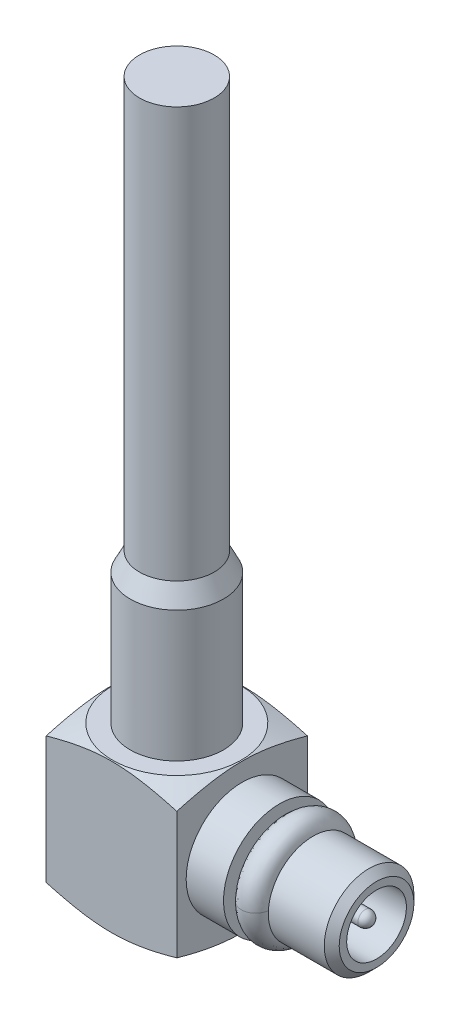
ISO-10303-21;
HEADER;
FILE_DESCRIPTION(('STEP AP214'),'2;1');
FILE_NAME('part.step','',(''),(''),'','','');
FILE_SCHEMA(('AUTOMOTIVE_DESIGN { 1 0 10303 214 1 1 1 1 }'));
ENDSEC;
DATA;
#1=APPLICATION_CONTEXT('core data for automotive mechanical design processes');
#2=APPLICATION_PROTOCOL_DEFINITION('international standard','automotive_design',2000,#1);
#3=PRODUCT_CONTEXT('',#1,'mechanical');
#4=PRODUCT('Part','Part','',(#3));
#5=PRODUCT_RELATED_PRODUCT_CATEGORY('part','',(#4));
#6=PRODUCT_DEFINITION_FORMATION('','',#4);
#7=PRODUCT_DEFINITION_CONTEXT('part definition',#1,'design');
#8=PRODUCT_DEFINITION('design','',#6,#7);
#9=PRODUCT_DEFINITION_SHAPE('','',#8);
#10=(LENGTH_UNIT() NAMED_UNIT(*) SI_UNIT(.MILLI.,.METRE.));
#11=(NAMED_UNIT(*) PLANE_ANGLE_UNIT() SI_UNIT($,.RADIAN.));
#12=(NAMED_UNIT(*) SI_UNIT($,.STERADIAN.) SOLID_ANGLE_UNIT());
#13=UNCERTAINTY_MEASURE_WITH_UNIT(LENGTH_MEASURE(1.E-05),#10,'distance_accuracy_value','');
#14=(GEOMETRIC_REPRESENTATION_CONTEXT(3) GLOBAL_UNCERTAINTY_ASSIGNED_CONTEXT((#13)) GLOBAL_UNIT_ASSIGNED_CONTEXT((#10,
#11,#12)) REPRESENTATION_CONTEXT('',''));
#15=CARTESIAN_POINT('',(0.,0.,0.));
#16=DIRECTION('',(0.,0.,1.));
#17=DIRECTION('',(1.,0.,0.));
#18=AXIS2_PLACEMENT_3D('',#15,#16,#17);
#19=CARTESIAN_POINT('',(5.05,2.,0.));
#20=DIRECTION('',(0.,0.,1.));
#21=DIRECTION('',(-1.,0.,0.));
#22=AXIS2_PLACEMENT_3D('',#19,#20,#21);
#23=SPHERICAL_SURFACE('',#22,0.2);
#24=CARTESIAN_POINT('',(5.05,2.,0.));
#25=DIRECTION('',(-1.,0.,0.));
#26=DIRECTION('',(0.,0.,1.));
#27=AXIS2_PLACEMENT_3D('',#24,#25,#26);
#28=CIRCLE('',#27,0.2);
#29=CARTESIAN_POINT('',(5.05,1.99999999993847,-0.2));
#30=VERTEX_POINT('',#29);
#31=CARTESIAN_POINT('',(5.05,1.99999999999102,0.2));
#32=VERTEX_POINT('',#31);
#33=EDGE_CURVE('E272',#30,#32,#28,.F.);
#34=ORIENTED_EDGE('',*,*,#33,.T.);
#35=CARTESIAN_POINT('',(5.05,2.,0.));
#36=DIRECTION('',(-1.,0.,0.));
#37=DIRECTION('',(0.,0.,1.));
#38=AXIS2_PLACEMENT_3D('',#35,#36,#37);
#39=CIRCLE('',#38,0.2);
#40=EDGE_CURVE('E167',#32,#30,#39,.F.);
#41=ORIENTED_EDGE('',*,*,#40,.T.);
#42=EDGE_LOOP('',(#34,#41));
#43=FACE_BOUND('',#42,.T.);
#44=ADVANCED_FACE('F35',(#43),#23,.T.);
#45=CARTESIAN_POINT('',(5.05,2.,0.));
#46=DIRECTION('',(-1.,0.,0.));
#47=DIRECTION('',(0.,-1.,0.));
#48=AXIS2_PLACEMENT_3D('',#45,#46,#47);
#49=CYLINDRICAL_SURFACE('',#48,0.2);
#50=CARTESIAN_POINT('',(3.85,2.,0.));
#51=DIRECTION('',(-1.,0.,0.));
#52=DIRECTION('',(0.,-1.,0.));
#53=AXIS2_PLACEMENT_3D('',#50,#51,#52);
#54=CIRCLE('',#53,0.2);
#55=CARTESIAN_POINT('',(3.85,1.8,0.));
#56=VERTEX_POINT('',#55);
#57=EDGE_CURVE('E39',#56,#56,#54,.T.);
#58=ORIENTED_EDGE('',*,*,#57,.F.);
#59=EDGE_LOOP('',(#58));
#60=FACE_BOUND('',#59,.T.);
#61=ORIENTED_EDGE('',*,*,#33,.F.);
#62=ORIENTED_EDGE('',*,*,#40,.F.);
#63=EDGE_LOOP('',(#61,#62));
#64=FACE_BOUND('',#63,.T.);
#65=ADVANCED_FACE('F173',(#60,#64),#49,.T.);
#66=CARTESIAN_POINT('',(3.85,1.1904,0.8096));
#67=DIRECTION('',(1.,0.,0.));
#68=DIRECTION('',(0.,0.,-1.));
#69=AXIS2_PLACEMENT_3D('',#66,#67,#68);
#70=PLANE('',#69);
#71=ORIENTED_EDGE('',*,*,#57,.T.);
#72=EDGE_LOOP('',(#71));
#73=FACE_BOUND('',#72,.T.);
#74=CARTESIAN_POINT('',(3.85,2.,0.));
#75=DIRECTION('',(1.,0.,0.));
#76=DIRECTION('',(0.,1.,0.));
#77=AXIS2_PLACEMENT_3D('',#74,#75,#76);
#78=CIRCLE('',#77,0.8);
#79=CARTESIAN_POINT('',(3.85,2.8,0.));
#80=VERTEX_POINT('',#79);
#81=EDGE_CURVE('E279',#80,#80,#78,.F.);
#82=ORIENTED_EDGE('',*,*,#81,.F.);
#83=EDGE_LOOP('',(#82));
#84=FACE_BOUND('',#83,.T.);
#85=ADVANCED_FACE('F176',(#73,#84),#70,.T.);
#86=CARTESIAN_POINT('',(3.85,2.,0.));
#87=DIRECTION('',(1.,0.,0.));
#88=DIRECTION('',(0.,1.,0.));
#89=AXIS2_PLACEMENT_3D('',#86,#87,#88);
#90=CYLINDRICAL_SURFACE('',#89,0.8);
#91=CARTESIAN_POINT('',(5.35,2.,0.));
#92=DIRECTION('',(1.,0.,0.));
#93=DIRECTION('',(0.,1.,0.));
#94=AXIS2_PLACEMENT_3D('',#91,#92,#93);
#95=CIRCLE('',#94,0.8);
#96=CARTESIAN_POINT('',(5.35,2.8,0.));
#97=VERTEX_POINT('',#96);
#98=EDGE_CURVE('E513',#97,#97,#95,.F.);
#99=ORIENTED_EDGE('',*,*,#98,.F.);
#100=EDGE_LOOP('',(#99));
#101=FACE_BOUND('',#100,.T.);
#102=ORIENTED_EDGE('',*,*,#81,.T.);
#103=EDGE_LOOP('',(#102));
#104=FACE_BOUND('',#103,.T.);
#105=ADVANCED_FACE('F179',(#101,#104),#90,.F.);
#106=CARTESIAN_POINT('',(5.35,0.988,1.012));
#107=DIRECTION('',(1.,0.,0.));
#108=DIRECTION('',(0.,0.,-1.));
#109=AXIS2_PLACEMENT_3D('',#106,#107,#108);
#110=PLANE('',#109);
#111=ORIENTED_EDGE('',*,*,#98,.T.);
#112=EDGE_LOOP('',(#111));
#113=FACE_BOUND('',#112,.T.);
#114=CARTESIAN_POINT('',(5.34999999999997,2.,0.));
#115=DIRECTION('',(-1.,0.,0.));
#116=DIRECTION('',(0.,0.,1.));
#117=AXIS2_PLACEMENT_3D('',#114,#115,#116);
#118=CIRCLE('',#117,1.00000000000003);
#119=CARTESIAN_POINT('',(5.34999999999997,2.,1.00000000000003));
#120=VERTEX_POINT('',#119);
#121=EDGE_CURVE('E164',#120,#120,#118,.F.);
#122=ORIENTED_EDGE('',*,*,#121,.T.);
#123=EDGE_LOOP('',(#122));
#124=FACE_BOUND('',#123,.T.);
#125=ADVANCED_FACE('F181',(#113,#124),#110,.T.);
#126=CARTESIAN_POINT('',(5.35,2.,0.));
#127=DIRECTION('',(-1.,0.,0.));
#128=DIRECTION('',(0.,0.,1.));
#129=AXIS2_PLACEMENT_3D('',#126,#127,#128);
#130=CONICAL_SURFACE('',#129,1.,0.785398163397447);
#131=ORIENTED_EDGE('',*,*,#121,.F.);
#132=EDGE_LOOP('',(#131));
#133=FACE_BOUND('',#132,.T.);
#134=CARTESIAN_POINT('',(5.15,2.,0.));
#135=DIRECTION('',(-1.,0.,0.));
#136=DIRECTION('',(0.,0.,1.));
#137=AXIS2_PLACEMENT_3D('',#134,#135,#136);
#138=CIRCLE('',#137,1.2);
#139=CARTESIAN_POINT('',(5.15,2.,1.2));
#140=VERTEX_POINT('',#139);
#141=EDGE_CURVE('E160',#140,#140,#138,.F.);
#142=ORIENTED_EDGE('',*,*,#141,.T.);
#143=EDGE_LOOP('',(#142));
#144=FACE_BOUND('',#143,.T.);
#145=ADVANCED_FACE('F184',(#133,#144),#130,.T.);
#146=CARTESIAN_POINT('',(5.15,2.,0.));
#147=DIRECTION('',(-1.,0.,0.));
#148=DIRECTION('',(0.,-1.,0.));
#149=AXIS2_PLACEMENT_3D('',#146,#147,#148);
#150=CYLINDRICAL_SURFACE('',#149,1.2);
#151=ORIENTED_EDGE('',*,*,#141,.F.);
#152=EDGE_LOOP('',(#151));
#153=FACE_BOUND('',#152,.T.);
#154=CARTESIAN_POINT('',(3.65,2.,0.));
#155=DIRECTION('',(-1.,0.,0.));
#156=DIRECTION('',(0.,-1.,0.));
#157=AXIS2_PLACEMENT_3D('',#154,#155,#156);
#158=CIRCLE('',#157,1.2);
#159=CARTESIAN_POINT('',(3.65,0.8,0.));
#160=VERTEX_POINT('',#159);
#161=EDGE_CURVE('E163',#160,#160,#158,.F.);
#162=ORIENTED_EDGE('',*,*,#161,.T.);
#163=EDGE_LOOP('',(#162));
#164=FACE_BOUND('',#163,.T.);
#165=ADVANCED_FACE('F190',(#153,#164),#150,.T.);
#166=CARTESIAN_POINT('',(3.65,0.7856,1.2144));
#167=DIRECTION('',(1.,0.,0.));
#168=DIRECTION('',(0.,0.,-1.));
#169=AXIS2_PLACEMENT_3D('',#166,#167,#168);
#170=PLANE('',#169);
#171=CARTESIAN_POINT('',(3.65,2.,0.));
#172=DIRECTION('',(-1.,0.,0.));
#173=DIRECTION('',(0.,0.,1.));
#174=AXIS2_PLACEMENT_3D('',#171,#172,#173);
#175=CIRCLE('',#174,1.);
#176=CARTESIAN_POINT('',(3.65,2.,1.));
#177=VERTEX_POINT('',#176);
#178=EDGE_CURVE('E153',#177,#177,#175,.F.);
#179=ORIENTED_EDGE('',*,*,#178,.T.);
#180=EDGE_LOOP('',(#179));
#181=FACE_BOUND('',#180,.T.);
#182=ORIENTED_EDGE('',*,*,#161,.F.);
#183=EDGE_LOOP('',(#182));
#184=FACE_BOUND('',#183,.T.);
#185=ADVANCED_FACE('F186',(#181,#184),#170,.F.);
#186=CARTESIAN_POINT('',(3.65,2.,0.));
#187=DIRECTION('',(-1.,0.,0.));
#188=DIRECTION('',(0.,0.,1.));
#189=AXIS2_PLACEMENT_3D('',#186,#187,#188);
#190=CYLINDRICAL_SURFACE('',#189,1.);
#191=CARTESIAN_POINT('',(3.56918829912818,2.,0.));
#192=DIRECTION('',(-1.,0.,0.));
#193=DIRECTION('',(0.,-1.,0.));
#194=AXIS2_PLACEMENT_3D('',#191,#192,#193);
#195=CIRCLE('',#194,1.00000000011661);
#196=CARTESIAN_POINT('',(3.56918829909613,2.,1.00000000008745));
#197=VERTEX_POINT('',#196);
#198=CARTESIAN_POINT('',(3.56918829909613,1.99999999989745,-1.00000000008745));
#199=VERTEX_POINT('',#198);
#200=EDGE_CURVE('E128',#197,#199,#195,.T.);
#201=ORIENTED_EDGE('',*,*,#200,.F.);
#202=CARTESIAN_POINT('',(3.56918829912818,2.,0.));
#203=DIRECTION('',(-1.,0.,0.));
#204=DIRECTION('',(0.,-1.,0.));
#205=AXIS2_PLACEMENT_3D('',#202,#203,#204);
#206=CIRCLE('',#205,1.00000000011661);
#207=EDGE_CURVE('E147',#199,#197,#206,.T.);
#208=ORIENTED_EDGE('',*,*,#207,.F.);
#209=EDGE_LOOP('',(#201,#208));
#210=FACE_BOUND('',#209,.T.);
#211=ORIENTED_EDGE('',*,*,#178,.F.);
#212=EDGE_LOOP('',(#211));
#213=FACE_BOUND('',#212,.T.);
#214=ADVANCED_FACE('F189',(#210,#213),#190,.T.);
#215=CARTESIAN_POINT('',(2.841641112,2.,-0.963592296));
#216=CARTESIAN_POINT('',(2.841641112,0.072815408,-0.963592296));
#217=CARTESIAN_POINT('',(2.841641112,0.072815408,0.963592296));
#218=CARTESIAN_POINT('',(2.841641112,2.,0.963592296));
#219=CARTESIAN_POINT('',(2.745890609,2.,-1.235039707));
#220=CARTESIAN_POINT('',(2.745890609,-0.470079413,-1.235039707));
#221=CARTESIAN_POINT('',(2.745890609,-0.470079413,1.235039707));
#222=CARTESIAN_POINT('',(2.745890609,2.,1.235039707));
#223=CARTESIAN_POINT('',(2.912160017,2.,-1.47));
#224=CARTESIAN_POINT('',(2.912160017,-0.94,-1.47));
#225=CARTESIAN_POINT('',(2.912160017,-0.94,1.47));
#226=CARTESIAN_POINT('',(2.912160017,2.,1.47));
#227=CARTESIAN_POINT('',(3.2,2.,-1.47));
#228=CARTESIAN_POINT('',(3.2,-0.94,-1.47));
#229=CARTESIAN_POINT('',(3.2,-0.94,1.47));
#230=CARTESIAN_POINT('',(3.2,2.,1.47));
#231=CARTESIAN_POINT('',(3.487839983,2.,-1.47));
#232=CARTESIAN_POINT('',(3.487839983,-0.94,-1.47));
#233=CARTESIAN_POINT('',(3.487839983,-0.94,1.47));
#234=CARTESIAN_POINT('',(3.487839983,2.,1.47));
#235=CARTESIAN_POINT('',(3.654109391,2.,-1.235039707));
#236=CARTESIAN_POINT('',(3.654109391,-0.470079413,-1.235039707));
#237=CARTESIAN_POINT('',(3.654109391,-0.470079413,1.235039707));
#238=CARTESIAN_POINT('',(3.654109391,2.,1.235039707));
#239=CARTESIAN_POINT('',(3.558358888,2.,-0.963592296));
#240=CARTESIAN_POINT('',(3.558358888,0.072815408,-0.963592296));
#241=CARTESIAN_POINT('',(3.558358888,0.072815408,0.963592296));
#242=CARTESIAN_POINT('',(3.558358888,2.,0.963592296));
#243=(BOUNDED_SURFACE() B_SPLINE_SURFACE(3,3,((#215,#216,#217,#218),(#219,#220,#221,#222),(#223,
#224,#225,#226),(#227,#228,#229,#230),(#231,#232,#233,#234),(#235,#236,#237,#238),(#239,#240,
#241,#242)),.UNSPECIFIED.,.F.,.F.,.F.) B_SPLINE_SURFACE_WITH_KNOTS((4,3,4),(4,4),(0.,0.5,1.),
(0.,1.),.UNSPECIFIED.) GEOMETRIC_REPRESENTATION_ITEM() RATIONAL_B_SPLINE_SURFACE(((1.,
0.333333333333333,0.333333333333333,1.),(0.71843018897567,0.239476729658557,0.239476729658557,
0.71843018897567),(0.71843018897567,0.239476729658557,0.239476729658557,0.71843018897567),(1.,
0.333333333333333,0.333333333333333,1.),(0.71843018897567,0.239476729658557,0.239476729658557,
0.71843018897567),(0.71843018897567,0.239476729658557,0.239476729658557,0.71843018897567),(1.,
0.333333333333333,0.333333333333333,1.))) REPRESENTATION_ITEM('') SURFACE());
#244=CARTESIAN_POINT('',(2.841641112,2.,0.963592296));
#245=CARTESIAN_POINT('',(2.745890609,2.,1.235039707));
#246=CARTESIAN_POINT('',(2.912160017,2.,1.47));
#247=CARTESIAN_POINT('',(3.2,2.,1.47));
#248=CARTESIAN_POINT('',(3.487839983,2.,1.47));
#249=CARTESIAN_POINT('',(3.654109391,2.,1.235039707));
#250=CARTESIAN_POINT('',(3.558358888,2.,0.963592296));
#251=(BOUNDED_CURVE() B_SPLINE_CURVE(3,(#244,#245,#246,#247,#248,#249,#250),.UNSPECIFIED.,.F.,
.F.) B_SPLINE_CURVE_WITH_KNOTS((4,3,4),(0.,0.5,1.),
.UNSPECIFIED.) CURVE() GEOMETRIC_REPRESENTATION_ITEM() RATIONAL_B_SPLINE_CURVE((1.,
0.71843018897567,0.71843018897567,1.,0.71843018897567,0.71843018897567,1.)) REPRESENTATION_ITEM(''));
#252=CARTESIAN_POINT('',(2.83081170097646,1.9999999999551,0.999999999994262));
#253=VERTEX_POINT('',#252);
#254=EDGE_CURVE('E122',#253,#197,#251,.T.);
#255=CARTESIAN_POINT('',(2.830811701,2.,0.));
#256=DIRECTION('',(-1.,0.,0.));
#257=DIRECTION('',(0.,0.,1.));
#258=AXIS2_PLACEMENT_3D('',#255,#256,#257);
#259=CIRCLE('',#258,1.);
#260=CARTESIAN_POINT('',(2.83081170097646,1.99999999969234,-0.999999999994262));
#261=VERTEX_POINT('',#260);
#262=EDGE_CURVE('E118',#253,#261,#259,.F.);
#263=CARTESIAN_POINT('',(2.841641112,2.,-0.963592296));
#264=CARTESIAN_POINT('',(2.745890609,2.,-1.235039707));
#265=CARTESIAN_POINT('',(2.912160017,2.,-1.47));
#266=CARTESIAN_POINT('',(3.2,2.,-1.47));
#267=CARTESIAN_POINT('',(3.487839983,2.,-1.47));
#268=CARTESIAN_POINT('',(3.654109391,2.,-1.235039707));
#269=CARTESIAN_POINT('',(3.558358888,2.,-0.963592296));
#270=(BOUNDED_CURVE() B_SPLINE_CURVE(3,(#263,#264,#265,#266,#267,#268,#269),.UNSPECIFIED.,.F.,
.F.) B_SPLINE_CURVE_WITH_KNOTS((4,3,4),(0.,0.5,1.),
.UNSPECIFIED.) CURVE() GEOMETRIC_REPRESENTATION_ITEM() RATIONAL_B_SPLINE_CURVE((1.,
0.71843018897567,0.71843018897567,1.,0.71843018897567,0.71843018897567,1.)) REPRESENTATION_ITEM(''));
#271=EDGE_CURVE('E125',#199,#261,#270,.F.);
#272=ORIENTED_EDGE('',*,*,#254,.F.);
#273=ORIENTED_EDGE('',*,*,#262,.T.);
#274=ORIENTED_EDGE('',*,*,#271,.F.);
#275=ORIENTED_EDGE('',*,*,#207,.T.);
#276=EDGE_LOOP('',(#272,#273,#274,#275));
#277=FACE_BOUND('',#276,.T.);
#278=ADVANCED_FACE('F381',(#277),#243,.T.);
#279=CARTESIAN_POINT('',(2.841641112,2.,0.963592296));
#280=CARTESIAN_POINT('',(2.841641112,3.927184592,0.963592296));
#281=CARTESIAN_POINT('',(2.841641112,3.927184592,-0.963592296));
#282=CARTESIAN_POINT('',(2.841641112,2.,-0.963592296));
#283=CARTESIAN_POINT('',(2.745890609,2.,1.235039707));
#284=CARTESIAN_POINT('',(2.745890609,4.470079413,1.235039707));
#285=CARTESIAN_POINT('',(2.745890609,4.470079413,-1.235039707));
#286=CARTESIAN_POINT('',(2.745890609,2.,-1.235039707));
#287=CARTESIAN_POINT('',(2.912160017,2.,1.47));
#288=CARTESIAN_POINT('',(2.912160017,4.94,1.47));
#289=CARTESIAN_POINT('',(2.912160017,4.94,-1.47));
#290=CARTESIAN_POINT('',(2.912160017,2.,-1.47));
#291=CARTESIAN_POINT('',(3.2,2.,1.47));
#292=CARTESIAN_POINT('',(3.2,4.94,1.47));
#293=CARTESIAN_POINT('',(3.2,4.94,-1.47));
#294=CARTESIAN_POINT('',(3.2,2.,-1.47));
#295=CARTESIAN_POINT('',(3.487839983,2.,1.47));
#296=CARTESIAN_POINT('',(3.487839983,4.94,1.47));
#297=CARTESIAN_POINT('',(3.487839983,4.94,-1.47));
#298=CARTESIAN_POINT('',(3.487839983,2.,-1.47));
#299=CARTESIAN_POINT('',(3.654109391,2.,1.235039707));
#300=CARTESIAN_POINT('',(3.654109391,4.470079413,1.235039707));
#301=CARTESIAN_POINT('',(3.654109391,4.470079413,-1.235039707));
#302=CARTESIAN_POINT('',(3.654109391,2.,-1.235039707));
#303=CARTESIAN_POINT('',(3.558358888,2.,0.963592296));
#304=CARTESIAN_POINT('',(3.558358888,3.927184592,0.963592296));
#305=CARTESIAN_POINT('',(3.558358888,3.927184592,-0.963592296));
#306=CARTESIAN_POINT('',(3.558358888,2.,-0.963592296));
#307=(BOUNDED_SURFACE() B_SPLINE_SURFACE(3,3,((#279,#280,#281,#282),(#283,#284,#285,#286),(#287,
#288,#289,#290),(#291,#292,#293,#294),(#295,#296,#297,#298),(#299,#300,#301,#302),(#303,#304,
#305,#306)),.UNSPECIFIED.,.F.,.F.,.F.) B_SPLINE_SURFACE_WITH_KNOTS((4,3,4),(4,4),(0.,0.5,1.),
(0.,1.),.UNSPECIFIED.) GEOMETRIC_REPRESENTATION_ITEM() RATIONAL_B_SPLINE_SURFACE(((1.,
0.333333333333333,0.333333333333333,1.),(0.71843018897567,0.239476729658557,0.239476729658557,
0.71843018897567),(0.71843018897567,0.239476729658557,0.239476729658557,0.71843018897567),(1.,
0.333333333333333,0.333333333333333,1.),(0.71843018897567,0.239476729658557,0.239476729658557,
0.71843018897567),(0.71843018897567,0.239476729658557,0.239476729658557,0.71843018897567),(1.,
0.333333333333333,0.333333333333333,1.))) REPRESENTATION_ITEM('') SURFACE());
#308=CARTESIAN_POINT('',(2.830811701,2.,0.));
#309=DIRECTION('',(-1.,0.,0.));
#310=DIRECTION('',(0.,0.,1.));
#311=AXIS2_PLACEMENT_3D('',#308,#309,#310);
#312=CIRCLE('',#311,1.);
#313=EDGE_CURVE('E121',#261,#253,#312,.F.);
#314=ORIENTED_EDGE('',*,*,#313,.T.);
#315=ORIENTED_EDGE('',*,*,#254,.T.);
#316=ORIENTED_EDGE('',*,*,#200,.T.);
#317=ORIENTED_EDGE('',*,*,#271,.T.);
#318=EDGE_LOOP('',(#314,#315,#316,#317));
#319=FACE_BOUND('',#318,.T.);
#320=ADVANCED_FACE('F373',(#319),#307,.T.);
#321=CARTESIAN_POINT('',(2.830811701,2.,0.));
#322=DIRECTION('',(-1.,0.,0.));
#323=DIRECTION('',(0.,0.,1.));
#324=AXIS2_PLACEMENT_3D('',#321,#322,#323);
#325=CYLINDRICAL_SURFACE('',#324,1.);
#326=CARTESIAN_POINT('',(2.75,2.,0.));
#327=DIRECTION('',(-1.,0.,0.));
#328=DIRECTION('',(0.,0.,1.));
#329=AXIS2_PLACEMENT_3D('',#326,#327,#328);
#330=CIRCLE('',#329,1.);
#331=CARTESIAN_POINT('',(2.75,2.,1.));
#332=VERTEX_POINT('',#331);
#333=EDGE_CURVE('E138',#332,#332,#330,.T.);
#334=ORIENTED_EDGE('',*,*,#333,.F.);
#335=EDGE_LOOP('',(#334));
#336=FACE_BOUND('',#335,.T.);
#337=ORIENTED_EDGE('',*,*,#313,.F.);
#338=ORIENTED_EDGE('',*,*,#262,.F.);
#339=EDGE_LOOP('',(#337,#338));
#340=FACE_BOUND('',#339,.T.);
#341=ADVANCED_FACE('F196',(#336,#340),#325,.T.);
#342=CARTESIAN_POINT('',(2.75,0.482,1.518));
#343=DIRECTION('',(1.,0.,0.));
#344=DIRECTION('',(0.,0.,-1.));
#345=AXIS2_PLACEMENT_3D('',#342,#343,#344);
#346=PLANE('',#345);
#347=ORIENTED_EDGE('',*,*,#333,.T.);
#348=EDGE_LOOP('',(#347));
#349=FACE_BOUND('',#348,.T.);
#350=CARTESIAN_POINT('',(2.75,2.,0.));
#351=DIRECTION('',(-1.,0.,0.));
#352=DIRECTION('',(0.,0.,1.));
#353=AXIS2_PLACEMENT_3D('',#350,#351,#352);
#354=CIRCLE('',#353,1.5);
#355=CARTESIAN_POINT('',(2.75,2.,1.5));
#356=VERTEX_POINT('',#355);
#357=EDGE_CURVE('E526',#356,#356,#354,.F.);
#358=ORIENTED_EDGE('',*,*,#357,.T.);
#359=EDGE_LOOP('',(#358));
#360=FACE_BOUND('',#359,.T.);
#361=ADVANCED_FACE('F192',(#349,#360),#346,.T.);
#362=CARTESIAN_POINT('',(-1.745572219,0.,-1.745572219));
#363=DIRECTION('',(0.,1.,0.));
#364=DIRECTION('',(0.,0.,1.));
#365=AXIS2_PLACEMENT_3D('',#362,#363,#364);
#366=PLANE('',#365);
#367=CARTESIAN_POINT('',(0.,-4.18998275203259E-10,0.));
#368=DIRECTION('',(0.,1.,0.));
#369=DIRECTION('',(0.,0.,1.));
#370=AXIS2_PLACEMENT_3D('',#367,#368,#369);
#371=CIRCLE('',#370,1.72487373429371);
#372=CARTESIAN_POINT('',(0.,-4.18998275203259E-10,1.72487373429371));
#373=VERTEX_POINT('',#372);
#374=EDGE_CURVE('E98',#373,#373,#371,.F.);
#375=ORIENTED_EDGE('',*,*,#374,.T.);
#376=EDGE_LOOP('',(#375));
#377=FACE_BOUND('',#376,.T.);
#378=ADVANCED_FACE('F195',(#377),#366,.F.);
#379=CARTESIAN_POINT('',(2.75,2.,0.));
#380=DIRECTION('',(-1.,0.,0.));
#381=DIRECTION('',(0.,0.,1.));
#382=AXIS2_PLACEMENT_3D('',#379,#380,#381);
#383=CYLINDRICAL_SURFACE('',#382,1.5);
#384=ORIENTED_EDGE('',*,*,#357,.F.);
#385=EDGE_LOOP('',(#384));
#386=FACE_BOUND('',#385,.T.);
#387=CARTESIAN_POINT('',(1.75,2.,0.));
#388=DIRECTION('',(-1.,0.,0.));
#389=DIRECTION('',(0.,0.,1.));
#390=AXIS2_PLACEMENT_3D('',#387,#388,#389);
#391=CIRCLE('',#390,1.5);
#392=CARTESIAN_POINT('',(1.75,2.,1.5));
#393=VERTEX_POINT('',#392);
#394=EDGE_CURVE('E112',#393,#393,#391,.F.);
#395=ORIENTED_EDGE('',*,*,#394,.T.);
#396=EDGE_LOOP('',(#395));
#397=FACE_BOUND('',#396,.T.);
#398=ADVANCED_FACE('F200',(#386,#397),#383,.T.);
#399=CARTESIAN_POINT('',(0.,-4.18991162836994E-10,0.));
#400=DIRECTION('',(0.,1.,0.));
#401=DIRECTION('',(0.,0.,1.));
#402=AXIS2_PLACEMENT_3D('',#399,#400,#401);
#403=CONICAL_SURFACE('',#402,1.72487373429373,1.19028994906997);
#404=CARTESIAN_POINT('',(-1.75000000005264,0.300000000001926,1.74999999995095));
#405=CARTESIAN_POINT('',(-1.75000000001891,0.277343892377994,1.66984025484135));
#406=CARTESIAN_POINT('',(-1.75000000000507,0.255376495742548,1.58947507055314));
#407=CARTESIAN_POINT('',(-1.74999999999493,0.213250057796904,1.42822964975774));
#408=CARTESIAN_POINT('',(-1.74999999999864,0.193091953293528,1.34734916938965));
#409=CARTESIAN_POINT('',(-1.75000000000137,0.154929292887335,1.18458232255644));
#410=CARTESIAN_POINT('',(-1.75000000000037,0.136937858724414,1.10269284413399));
#411=CARTESIAN_POINT('',(-1.74999999999963,0.103820651591177,0.938340482380735));
#412=CARTESIAN_POINT('',(-1.7499999999999,0.0886945065931123,0.855877674934067));
#413=CARTESIAN_POINT('',(-1.75000000000009,0.0623358238787216,0.692802059846125));
#414=CARTESIAN_POINT('',(-1.75000000000003,0.0510021973246043,0.612205832563477));
#415=CARTESIAN_POINT('',(-1.74999999999998,0.0322176998984324,0.450564347562989));
#416=CARTESIAN_POINT('',(-1.74999999999999,0.0247663273961863,0.36951914922551));
#417=CARTESIAN_POINT('',(-1.75000000000001,0.0142241930304569,0.207366130271185));
#418=CARTESIAN_POINT('',(-1.75,0.0111213074862501,0.126259117092636));
#419=CARTESIAN_POINT('',(-1.75,0.00944519765535009,-0.0359956845704734));
#420=CARTESIAN_POINT('',(-1.75,0.010871770195776,-0.117143471062859));
#421=CARTESIAN_POINT('',(-1.75,0.0203844175750047,-0.328165376810296));
#422=CARTESIAN_POINT('',(-1.75,0.0319700791483235,-0.457889301824149));
#423=CARTESIAN_POINT('',(-1.75,0.0648175785507928,-0.716321982760633));
#424=CARTESIAN_POINT('',(-1.75,0.0861005791351572,-0.84502788877007));
#425=CARTESIAN_POINT('',(-1.75,0.13646744692654,-1.10417382883707));
#426=CARTESIAN_POINT('',(-1.75,0.165731382352873,-1.23457791882599));
#427=CARTESIAN_POINT('',(-1.75,0.213527538837027,-1.42890603289927));
#428=CARTESIAN_POINT('',(-1.75,0.230070706517323,-1.49333466666709));
#429=CARTESIAN_POINT('',(-1.75,0.264259350602957,-1.62188453921529));
#430=CARTESIAN_POINT('',(-1.75,0.281904588452892,-1.6860058413076));
#431=CARTESIAN_POINT('',(-1.75,0.300000000043209,-1.74999999994909));
#432=B_SPLINE_CURVE_WITH_KNOTS('',3,(#404,#405,#406,#407,#408,#409,#410,#411,#412,#413,#414,
#415,#416,#417,#418,#419,#420,#421,#422,#423,#424,#425,#426,#427,#428,#429,#430,#431),
.UNSPECIFIED.,.F.,.F.,(4,2,2,2,2,2,2,2,2,2,2,2,2,4),(0.,0.249912407687991,0.49995347625099,
0.751439863802241,1.00289357606844,1.24698038116211,1.49103563971256,1.73440910374937,
1.97777165120669,2.368011002196,2.75910609209306,3.15988275266041,3.3594320302765,
3.55893826192699),.UNSPECIFIED.);
#433=CARTESIAN_POINT('',(-1.74999999997,0.300000000040639,1.74999999997));
#434=VERTEX_POINT('',#433);
#435=CARTESIAN_POINT('',(-1.75,0.300000000049124,-1.74999999997));
#436=VERTEX_POINT('',#435);
#437=EDGE_CURVE('E82',#434,#436,#432,.T.);
#438=ORIENTED_EDGE('',*,*,#437,.T.);
#439=CARTESIAN_POINT('',(-1.74999999995095,0.300000000001926,-1.75000000005264));
#440=CARTESIAN_POINT('',(-1.67792974541954,0.279626464840247,-1.75000000001855));
#441=CARTESIAN_POINT('',(-1.60569506989051,0.259814745862892,-1.75000000000489));
#442=CARTESIAN_POINT('',(-1.46082353166753,0.22162068302558,-1.74999999999511));
#443=CARTESIAN_POINT('',(-1.3881865402013,0.203238828992467,-1.74999999999901));
#444=CARTESIAN_POINT('',(-1.24209996919839,0.168131764033121,-1.750000000001));
#445=CARTESIAN_POINT('',(-1.16864812329131,0.151415850823692,-1.74999999999907));
#446=CARTESIAN_POINT('',(-1.02129642298288,0.120150310511673,-1.75000000000093));
#447=CARTESIAN_POINT('',(-0.947396606838389,0.105600501061431,-1.75000000000471));
#448=CARTESIAN_POINT('',(-0.728968254578805,0.0665997488608526,-1.74999999999083));
#449=CARTESIAN_POINT('',(-0.583732590608136,0.0457964427955599,-1.74999999994949));
#450=CARTESIAN_POINT('',(-0.365112061457696,0.0245634651551529,-1.75000000002519));
#451=CARTESIAN_POINT('',(-0.292198742584532,0.0191483468448058,-1.75000000007324));
#452=CARTESIAN_POINT('',(-0.146190278663107,0.0118919227861608,-1.74999999992676));
#453=CARTESIAN_POINT('',(-0.0730951393315535,0.0100505060626468,-1.74999999973225));
#454=CARTESIAN_POINT('',(0.0730951393320002,0.0100505060626493,-1.74999999973225));
#455=CARTESIAN_POINT('',(0.146190278664,0.0118919227861882,-1.74999999992676));
#456=CARTESIAN_POINT('',(0.292198742586306,0.0191483468449109,-1.75000000007325));
#457=CARTESIAN_POINT('',(0.365112061459907,0.0245634651553102,-1.75000000002522));
#458=CARTESIAN_POINT('',(0.583732590611608,0.0457964427960117,-1.74999999994945));
#459=CARTESIAN_POINT('',(0.72896825458307,0.066599748861685,-1.74999999999058));
#460=CARTESIAN_POINT('',(0.94739660684399,0.105600501062395,-1.75000000000484));
#461=CARTESIAN_POINT('',(1.02129642298896,0.120150310512606,-1.7500000000013));
#462=CARTESIAN_POINT('',(1.16864812329805,0.151415850825481,-1.7499999999987));
#463=CARTESIAN_POINT('',(1.24209996920531,0.168131764035795,-1.74999999999963));
#464=CARTESIAN_POINT('',(1.38818654020958,0.203238828993451,-1.75000000000037));
#465=CARTESIAN_POINT('',(1.46082353167702,0.221620683024008,-1.75000000000018));
#466=CARTESIAN_POINT('',(1.60569506989897,0.259814745869191,-1.74999999999982));
#467=CARTESIAN_POINT('',(1.67792974542577,0.27962646485697,-1.74999999999963));
#468=CARTESIAN_POINT('',(1.74999999995095,0.300000000043736,-1.75));
#469=B_SPLINE_CURVE_WITH_KNOTS('',3,(#439,#440,#441,#442,#443,#444,#445,#446,#447,#448,#449,
#450,#451,#452,#453,#454,#455,#456,#457,#458,#459,#460,#461,#462,#463,#464,#465,#466,#467,#468),
.UNSPECIFIED.,.F.,.F.,(4,2,2,2,2,2,2,2,2,2,2,2,2,2,4),(0.,0.224689074690876,0.449454784894143,
0.675411894431164,0.901349971604272,1.34093894268624,1.56020735988023,1.77946896795803,
1.99873057603718,2.21799899323247,2.65758796431701,2.88352604149149,3.1094831510297,
3.3342488612344,3.5589379359271),.UNSPECIFIED.);
#470=CARTESIAN_POINT('',(1.74999999997,0.300000000049124,-1.75));
#471=VERTEX_POINT('',#470);
#472=EDGE_CURVE('E116',#436,#471,#469,.T.);
#473=ORIENTED_EDGE('',*,*,#472,.T.);
#474=CARTESIAN_POINT('',(1.75000000005264,0.300000000001926,-1.74999999995095));
#475=CARTESIAN_POINT('',(1.75000000001891,0.277343892377994,-1.66984025484135));
#476=CARTESIAN_POINT('',(1.75000000000507,0.255376495742548,-1.58947507055314));
#477=CARTESIAN_POINT('',(1.74999999999493,0.213250057796904,-1.42822964975774));
#478=CARTESIAN_POINT('',(1.74999999999864,0.193091953293528,-1.34734916938965));
#479=CARTESIAN_POINT('',(1.75000000000137,0.154929292887335,-1.18458232255644));
#480=CARTESIAN_POINT('',(1.75000000000037,0.136937858724414,-1.10269284413399));
#481=CARTESIAN_POINT('',(1.74999999999963,0.103820651591177,-0.938340482380735));
#482=CARTESIAN_POINT('',(1.7499999999999,0.0886945065931123,-0.855877674934067));
#483=CARTESIAN_POINT('',(1.75000000000009,0.0623358238787216,-0.692802059846125));
#484=CARTESIAN_POINT('',(1.75000000000003,0.0510021973246043,-0.612205832563477));
#485=CARTESIAN_POINT('',(1.74999999999998,0.0322176998984324,-0.450564347562989));
#486=CARTESIAN_POINT('',(1.74999999999999,0.0247663273961863,-0.36951914922551));
#487=CARTESIAN_POINT('',(1.75000000000001,0.0142241930304569,-0.207366130271185));
#488=CARTESIAN_POINT('',(1.75,0.0111213074862501,-0.126259117092636));
#489=CARTESIAN_POINT('',(1.75,0.00944519765535009,0.0359956845704734));
#490=CARTESIAN_POINT('',(1.75,0.010871770195776,0.117143471062859));
#491=CARTESIAN_POINT('',(1.75,0.0203844175750047,0.328165376810296));
#492=CARTESIAN_POINT('',(1.75,0.0319700791483235,0.457889301824149));
#493=CARTESIAN_POINT('',(1.75,0.0648175785507928,0.716321982760633));
#494=CARTESIAN_POINT('',(1.75,0.0861005791351572,0.84502788877007));
#495=CARTESIAN_POINT('',(1.75,0.13646744692654,1.10417382883707));
#496=CARTESIAN_POINT('',(1.75,0.165731382352873,1.23457791882599));
#497=CARTESIAN_POINT('',(1.75,0.213527538837027,1.42890603289927));
#498=CARTESIAN_POINT('',(1.75,0.230070706517323,1.49333466666709));
#499=CARTESIAN_POINT('',(1.75,0.264259350602957,1.62188453921529));
#500=CARTESIAN_POINT('',(1.75,0.281904588452892,1.6860058413076));
#501=CARTESIAN_POINT('',(1.75,0.300000000043209,1.74999999994909));
#502=B_SPLINE_CURVE_WITH_KNOTS('',3,(#474,#475,#476,#477,#478,#479,#480,#481,#482,#483,#484,
#485,#486,#487,#488,#489,#490,#491,#492,#493,#494,#495,#496,#497,#498,#499,#500,#501),
.UNSPECIFIED.,.F.,.F.,(4,2,2,2,2,2,2,2,2,2,2,2,2,4),(0.,0.249912407687991,0.49995347625099,
0.751439863802241,1.00289357606844,1.24698038116211,1.49103563971256,1.73440910374937,
1.97777165120669,2.368011002196,2.75910609209306,3.15988275266041,3.3594320302765,
3.55893826192699),.UNSPECIFIED.);
#503=CARTESIAN_POINT('',(1.75,0.300000000049124,1.74999999997));
#504=VERTEX_POINT('',#503);
#505=EDGE_CURVE('E85',#471,#504,#502,.T.);
#506=ORIENTED_EDGE('',*,*,#505,.T.);
#507=CARTESIAN_POINT('',(1.74999999995095,0.300000000001926,1.75000000005264));
#508=CARTESIAN_POINT('',(1.67792974542539,0.279626464841899,1.75000000001855));
#509=CARTESIAN_POINT('',(1.60569506990225,0.259814745866108,1.75000000000489));
#510=CARTESIAN_POINT('',(1.4608235316911,0.221620683031669,1.74999999999511));
#511=CARTESIAN_POINT('',(1.38818654023082,0.203238828999865,1.74999999999901));
#512=CARTESIAN_POINT('',(1.24209996923998,0.168131764042811,1.750000000001));
#513=CARTESIAN_POINT('',(1.168648123339,0.151415850834362,1.74999999999907));
#514=CARTESIAN_POINT('',(1.02129642304286,0.120150310523847,1.75000000000093));
#515=CARTESIAN_POINT('',(0.94739660690455,0.105600501074129,1.75000000000471));
#516=CARTESIAN_POINT('',(0.728968254663011,0.0665997488741756,1.74999999999083));
#517=CARTESIAN_POINT('',(0.583732590704324,0.0457964428081859,1.74999999994949));
#518=CARTESIAN_POINT('',(0.365112061571799,0.0245634651645917,1.75000000002519));
#519=CARTESIAN_POINT('',(0.292198742704581,0.0191483468528282,1.75000000007324));
#520=CARTESIAN_POINT('',(0.146190278794984,0.0118919227906624,1.74999999992676));
#521=CARTESIAN_POINT('',(0.0730951394693095,0.0100505060650442,1.74999999973225));
#522=CARTESIAN_POINT('',(-0.0730951391942441,0.010050506060252,1.74999999973225));
#523=CARTESIAN_POINT('',(-0.146190278532124,0.0118919227816866,1.74999999992676));
#524=CARTESIAN_POINT('',(-0.292198742466257,0.0191483468368885,1.75000000007325));
#525=CARTESIAN_POINT('',(-0.365112061345805,0.0245634651458715,1.75000000002522));
#526=CARTESIAN_POINT('',(-0.583732590515421,0.0457964427833858,1.74999999994945));
#527=CARTESIAN_POINT('',(-0.728968254498864,0.0665997488483619,1.74999999999058));
#528=CARTESIAN_POINT('',(-0.94739660677783,0.105600501049697,1.75000000000484));
#529=CARTESIAN_POINT('',(-1.02129642292898,0.120150310500432,1.7500000000013));
#530=CARTESIAN_POINT('',(-1.16864812325036,0.151415850814811,1.7499999999987));
#531=CARTESIAN_POINT('',(-1.24209996916372,0.168131764026105,1.74999999999963));
#532=CARTESIAN_POINT('',(-1.38818654018006,0.203238828986053,1.75000000000037));
#533=CARTESIAN_POINT('',(-1.46082353165345,0.221620683017919,1.75000000000018));
#534=CARTESIAN_POINT('',(-1.60569506988724,0.259814745865975,1.74999999999982));
#535=CARTESIAN_POINT('',(-1.67792974541992,0.279626464855319,1.74999999999963));
#536=CARTESIAN_POINT('',(-1.74999999995095,0.300000000043736,1.75));
#537=B_SPLINE_CURVE_WITH_KNOTS('',3,(#507,#508,#509,#510,#511,#512,#513,#514,#515,#516,#517,
#518,#519,#520,#521,#522,#523,#524,#525,#526,#527,#528,#529,#530,#531,#532,#533,#534,#535,#536),
.UNSPECIFIED.,.F.,.F.,(4,2,2,2,2,2,2,2,2,2,2,2,2,2,4),(0.,0.224689074672628,0.449454784857616,
0.675411894376135,0.901349971530748,1.34093894257763,1.56020735975417,1.77946896781452,
1.99873057591111,2.21799899312386,2.65758796424349,2.88352604143646,3.10948315099317,
3.33424886121615,3.5589379359271),.UNSPECIFIED.);
#538=EDGE_CURVE('E78',#504,#434,#537,.T.);
#539=ORIENTED_EDGE('',*,*,#538,.T.);
#540=EDGE_LOOP('',(#438,#473,#506,#539));
#541=FACE_BOUND('',#540,.T.);
#542=ORIENTED_EDGE('',*,*,#374,.F.);
#543=EDGE_LOOP('',(#542));
#544=FACE_BOUND('',#543,.T.);
#545=ADVANCED_FACE('F80',(#541,#544),#403,.T.);
#546=CARTESIAN_POINT('',(-1.75,-0.058159022,1.75));
#547=DIRECTION('',(1.,0.,0.));
#548=DIRECTION('',(0.,0.,-1.));
#549=AXIS2_PLACEMENT_3D('',#546,#547,#548);
#550=PLANE('',#549);
#551=ORIENTED_EDGE('',*,*,#437,.F.);
#552=DIRECTION('',(0.,1.,0.));
#553=VECTOR('',#552,1.);
#554=CARTESIAN_POINT('',(-1.75,2.,1.75));
#555=LINE('',#554,#553);
#556=CARTESIAN_POINT('',(-1.74999999998911,3.69999999994547,1.75));
#557=VERTEX_POINT('',#556);
#558=EDGE_CURVE('E88',#434,#557,#555,.T.);
#559=ORIENTED_EDGE('',*,*,#558,.T.);
#560=CARTESIAN_POINT('',(-1.75,3.69999999995323,1.74999999996169));
#561=CARTESIAN_POINT('',(-1.75,3.72265610760218,1.66984025485884));
#562=CARTESIAN_POINT('',(-1.75,3.74462350424799,1.58947507057339));
#563=CARTESIAN_POINT('',(-1.75,3.78674994220143,1.42822964978013));
#564=CARTESIAN_POINT('',(-1.75,3.80690804670222,1.34734916941141));
#565=CARTESIAN_POINT('',(-1.75,3.84507070710673,1.1845823225781));
#566=CARTESIAN_POINT('',(-1.75,3.86306214127056,1.10269284415618));
#567=CARTESIAN_POINT('',(-1.75,3.89617934840476,0.938340482403659));
#568=CARTESIAN_POINT('',(-1.75,3.91130549340289,0.855877674957199));
#569=CARTESIAN_POINT('',(-1.75,3.93766417611766,0.692802059870072));
#570=CARTESIAN_POINT('',(-1.75,3.94899780267212,0.612205832588031));
#571=CARTESIAN_POINT('',(-1.75,3.967782300099,0.450564347588741));
#572=CARTESIAN_POINT('',(-1.75,3.97523367260163,0.369519149251854));
#573=CARTESIAN_POINT('',(-1.75,3.98577580696823,0.207366130298622));
#574=CARTESIAN_POINT('',(-1.75,3.98887869251293,0.126259117120573));
#575=CARTESIAN_POINT('',(-1.75,3.99055480234488,-0.0359956845415842));
#576=CARTESIAN_POINT('',(-1.75,3.98912822980501,-0.117143471033519));
#577=CARTESIAN_POINT('',(-1.75,3.97961558242649,-0.328165376796306));
#578=CARTESIAN_POINT('',(-1.75,3.96802992085188,-0.457889301825923));
#579=CARTESIAN_POINT('',(-1.75,3.93518242144459,-0.716321982793596));
#580=CARTESIAN_POINT('',(-1.75,3.91389942085668,-0.845027888818456));
#581=CARTESIAN_POINT('',(-1.75,3.86353255305661,-1.10417382891718));
#582=CARTESIAN_POINT('',(-1.75,3.83426861762506,-1.2345779189224));
#583=CARTESIAN_POINT('',(-1.75,3.7864724611325,-1.42890603301986));
#584=CARTESIAN_POINT('',(-1.75,3.76992929344932,-1.49333466679568));
#585=CARTESIAN_POINT('',(-1.75,3.73574064935777,-1.62188453935983));
#586=CARTESIAN_POINT('',(-1.75,3.71809541150481,-1.68600584146008));
#587=CARTESIAN_POINT('',(-1.75,3.69999999991142,-1.75000000010949));
#588=B_SPLINE_CURVE_WITH_KNOTS('',3,(#560,#561,#562,#563,#564,#565,#566,#567,#568,#569,#570,
#571,#572,#573,#574,#575,#576,#577,#578,#579,#580,#581,#582,#583,#584,#585,#586,#587),
.UNSPECIFIED.,.F.,.F.,(4,2,2,2,2,2,2,2,2,2,2,2,2,4),(0.,0.249912407688181,0.499953476250931,
0.751439863801344,1.00289357606691,1.24698038115895,1.49103563970773,1.7344091037431,
1.97777165119904,2.36801100223561,2.75910609217998,3.15988275279841,3.3594320304399,
3.55893826211577),.UNSPECIFIED.);
#589=CARTESIAN_POINT('',(-1.75,3.69999999992667,-1.75000000005558));
#590=VERTEX_POINT('',#589);
#591=EDGE_CURVE('E103',#557,#590,#588,.T.);
#592=ORIENTED_EDGE('',*,*,#591,.T.);
#593=DIRECTION('',(0.,-1.,0.));
#594=VECTOR('',#593,1.);
#595=CARTESIAN_POINT('',(-1.75,2.,-1.75));
#596=LINE('',#595,#594);
#597=EDGE_CURVE('E97',#590,#436,#596,.T.);
#598=ORIENTED_EDGE('',*,*,#597,.T.);
#599=EDGE_LOOP('',(#551,#559,#592,#598));
#600=FACE_BOUND('',#599,.T.);
#601=ADVANCED_FACE('F93',(#600),#550,.F.);
#602=CARTESIAN_POINT('',(-1.75,-0.058159022,-1.75));
#603=DIRECTION('',(0.,0.,1.));
#604=DIRECTION('',(1.,0.,0.));
#605=AXIS2_PLACEMENT_3D('',#602,#603,#604);
#606=PLANE('',#605);
#607=ORIENTED_EDGE('',*,*,#472,.F.);
#608=ORIENTED_EDGE('',*,*,#597,.F.);
#609=CARTESIAN_POINT('',(-1.74999999982875,3.69999999999083,-1.75));
#610=CARTESIAN_POINT('',(-1.67792974530799,3.72037353517553,-1.74999999999948));
#611=CARTESIAN_POINT('',(-1.60569506978561,3.74018525416141,-1.74999999999974));
#612=CARTESIAN_POINT('',(-1.46082353157301,3.77837931700269,-1.75000000000026));
#613=CARTESIAN_POINT('',(-1.38818654011052,3.79676117103126,-1.75000000000052));
#614=CARTESIAN_POINT('',(-1.24209996911823,3.83186823598423,-1.74999999999948));
#615=CARTESIAN_POINT('',(-1.16864812321804,3.84858414919188,-1.74999999999817));
#616=CARTESIAN_POINT('',(-1.02129642292278,3.87984968950105,-1.75000000000183));
#617=CARTESIAN_POINT('',(-0.94739660678458,3.89439949895019,-1.75000000000681));
#618=CARTESIAN_POINT('',(-0.728968254540753,3.93340025114203,-1.74999999998675));
#619=CARTESIAN_POINT('',(-0.583732590579621,3.9542035571938,-1.74999999992888));
#620=CARTESIAN_POINT('',(-0.365112061443185,3.97543653485295,-1.75000000003548));
#621=CARTESIAN_POINT('',(-0.292198742574152,3.98085165317601,-1.75000000010305));
#622=CARTESIAN_POINT('',(-0.146190278658944,3.98810807719375,-1.74999999989695));
#623=CARTESIAN_POINT('',(-0.0730951393294717,3.98994949386359,-1.7499999996233));
#624=CARTESIAN_POINT('',(0.0730951393245816,3.98994949386359,-1.7499999996233));
#625=CARTESIAN_POINT('',(0.146190278649162,3.988108077194,-1.74999999989695));
#626=CARTESIAN_POINT('',(0.292198742554622,3.98085165317722,-1.75000000010305));
#627=CARTESIAN_POINT('',(0.365112061418798,3.97543653485487,-1.75000000003548));
#628=CARTESIAN_POINT('',(0.58373259054069,3.95420355719847,-1.74999999992888));
#629=CARTESIAN_POINT('',(0.728968254492223,3.93340025114933,-1.74999999998675));
#630=CARTESIAN_POINT('',(0.947396606721578,3.89439949896215,-1.75000000000681));
#631=CARTESIAN_POINT('',(1.02129642285481,3.87984968951472,-1.75000000000183));
#632=CARTESIAN_POINT('',(1.16864812314017,3.84858414920916,-1.74999999999817));
#633=CARTESIAN_POINT('',(1.24209996903543,3.83186823600337,-1.74999999999948));
#634=CARTESIAN_POINT('',(1.388186540018,3.79676117105424,-1.75000000000052));
#635=CARTESIAN_POINT('',(1.4608235314757,3.77837931702762,-1.75000000000026));
#636=CARTESIAN_POINT('',(1.60569506967873,3.7401852541903,-1.74999999999974));
#637=CARTESIAN_POINT('',(1.67792974519635,3.72037353520644,-1.74999999999948));
#638=CARTESIAN_POINT('',(1.74999999971235,3.70000000002375,-1.75));
#639=B_SPLINE_CURVE_WITH_KNOTS('',3,(#609,#610,#611,#612,#613,#614,#615,#616,#617,#618,#619,
#620,#621,#622,#623,#624,#625,#626,#627,#628,#629,#630,#631,#632,#633,#634,#635,#636,#637,#638),
.UNSPECIFIED.,.F.,.F.,(4,2,2,2,2,2,2,2,2,2,2,2,2,2,4),(0.,0.224689074678348,0.449454784867192,
0.67541189438314,0.901349971536551,1.34093894258893,1.56020735977102,1.77946896784026,
1.99873057589483,2.21799899306224,2.65758796408508,2.88352604122285,3.10948315072315,
3.33424886089661,3.55893793555958),.UNSPECIFIED.);
#640=CARTESIAN_POINT('',(1.74999999985617,3.69999999998307,-1.75));
#641=VERTEX_POINT('',#640);
#642=EDGE_CURVE('E105',#590,#641,#639,.T.);
#643=ORIENTED_EDGE('',*,*,#642,.T.);
#644=DIRECTION('',(0.,-1.,0.));
#645=VECTOR('',#644,1.);
#646=CARTESIAN_POINT('',(1.75,2.,-1.75));
#647=LINE('',#646,#645);
#648=EDGE_CURVE('E113',#641,#471,#647,.T.);
#649=ORIENTED_EDGE('',*,*,#648,.T.);
#650=EDGE_LOOP('',(#607,#608,#643,#649));
#651=FACE_BOUND('',#650,.T.);
#652=ADVANCED_FACE('F205',(#651),#606,.F.);
#653=CARTESIAN_POINT('',(1.75,-0.058159022,-1.75));
#654=DIRECTION('',(-1.,0.,0.));
#655=DIRECTION('',(0.,0.,1.));
#656=AXIS2_PLACEMENT_3D('',#653,#654,#655);
#657=PLANE('',#656);
#658=ORIENTED_EDGE('',*,*,#394,.F.);
#659=EDGE_LOOP('',(#658));
#660=FACE_BOUND('',#659,.T.);
#661=ORIENTED_EDGE('',*,*,#505,.F.);
#662=ORIENTED_EDGE('',*,*,#648,.F.);
#663=CARTESIAN_POINT('',(1.74999999992748,3.6999999998247,-1.75000000021248));
#664=CARTESIAN_POINT('',(1.74999999997395,3.72265610751082,-1.66984025511475));
#665=CARTESIAN_POINT('',(1.74999999999302,3.7446235041737,-1.58947507082893));
#666=CARTESIAN_POINT('',(1.75000000000699,3.78674994214362,-1.4282296500303));
#667=CARTESIAN_POINT('',(1.75000000000188,3.80690804664384,-1.34734916965657));
#668=CARTESIAN_POINT('',(1.74999999999811,3.84507070705217,-1.18458232281464));
#669=CARTESIAN_POINT('',(1.74999999999949,3.86306214122045,-1.1026928443891));
#670=CARTESIAN_POINT('',(1.75000000000051,3.89617934836255,-0.938340482628873));
#671=CARTESIAN_POINT('',(1.75000000000013,3.91130549336411,-0.85587767517831));
#672=CARTESIAN_POINT('',(1.74999999999987,3.93766417608607,-0.692802060083757));
#673=CARTESIAN_POINT('',(1.74999999999997,3.94899780264429,-0.612205832798397));
#674=CARTESIAN_POINT('',(1.75000000000003,3.96778230007872,-0.450564347792306));
#675=CARTESIAN_POINT('',(1.75000000000001,3.97523367258512,-0.369519149451938));
#676=CARTESIAN_POINT('',(1.74999999999999,3.98577580695918,-0.207366130491496));
#677=CARTESIAN_POINT('',(1.75,3.98887869250755,-0.126259117309719));
#678=CARTESIAN_POINT('',(1.75,3.99055480234644,0.0359956843601199));
#679=CARTESIAN_POINT('',(1.75,3.98912822980985,0.117143470856007));
#680=CARTESIAN_POINT('',(1.75,3.97961558243972,0.328165376614635));
#681=CARTESIAN_POINT('',(1.75,3.96802992087104,0.457889301636314));
#682=CARTESIAN_POINT('',(1.75,3.93518242147566,0.716321982588356));
#683=CARTESIAN_POINT('',(1.75,3.91389942089376,0.845027888605526));
#684=CARTESIAN_POINT('',(1.75,3.86353255310535,1.10417382868918));
#685=CARTESIAN_POINT('',(1.75,3.83426861767941,1.234577918687));
#686=CARTESIAN_POINT('',(1.75,3.78647246119484,1.42890603277352));
#687=CARTESIAN_POINT('',(1.75,3.76992929351422,1.49333466654577));
#688=CARTESIAN_POINT('',(1.75,3.73574064942768,1.62188453910278));
#689=CARTESIAN_POINT('',(1.75,3.71809541157716,1.68600584119945));
#690=CARTESIAN_POINT('',(1.75,3.69999999998615,1.74999999984529));
#691=B_SPLINE_CURVE_WITH_KNOTS('',3,(#663,#664,#665,#666,#667,#668,#669,#670,#671,#672,#673,
#674,#675,#676,#677,#678,#679,#680,#681,#682,#683,#684,#685,#686,#687,#688,#689,#690),
.UNSPECIFIED.,.F.,.F.,(4,2,2,2,2,2,2,2,2,2,2,2,2,4),(0.,0.249912407702712,0.499953476279373,
0.751439863843395,1.00289357612287,1.24698038122637,1.49103563978658,1.73440910383355,
1.97777165130115,2.36801100231245,2.75910609223107,3.15988275282416,3.35943203045337,
3.55893826211696),.UNSPECIFIED.);
#692=CARTESIAN_POINT('',(1.75,3.69999999996427,1.74999999992264));
#693=VERTEX_POINT('',#692);
#694=EDGE_CURVE('E54',#641,#693,#691,.T.);
#695=ORIENTED_EDGE('',*,*,#694,.T.);
#696=DIRECTION('',(0.,-1.,0.));
#697=VECTOR('',#696,1.);
#698=CARTESIAN_POINT('',(1.75,2.,1.75));
#699=LINE('',#698,#697);
#700=EDGE_CURVE('E89',#693,#504,#699,.T.);
#701=ORIENTED_EDGE('',*,*,#700,.T.);
#702=EDGE_LOOP('',(#661,#662,#695,#701));
#703=FACE_BOUND('',#702,.T.);
#704=ADVANCED_FACE('F239',(#660,#703),#657,.F.);
#705=CARTESIAN_POINT('',(1.75,-0.058159022,1.75));
#706=DIRECTION('',(0.,0.,-1.));
#707=DIRECTION('',(-1.,0.,0.));
#708=AXIS2_PLACEMENT_3D('',#705,#706,#707);
#709=PLANE('',#708);
#710=ORIENTED_EDGE('',*,*,#538,.F.);
#711=ORIENTED_EDGE('',*,*,#700,.F.);
#712=CARTESIAN_POINT('',(1.75000000009447,3.69999999991509,1.74999999999927));
#713=CARTESIAN_POINT('',(1.67792974554973,3.72037353510884,1.74999999999974));
#714=CARTESIAN_POINT('',(1.60569507000323,3.7401852541028,1.74999999999993));
#715=CARTESIAN_POINT('',(1.46082353174042,3.77837931695981,1.75000000000007));
#716=CARTESIAN_POINT('',(1.38818654025183,3.79676117099598,1.75000000000002));
#717=CARTESIAN_POINT('',(1.2420999692002,3.83186823596585,1.74999999999998));
#718=CARTESIAN_POINT('',(1.16864812326673,3.84858414918264,1.75));
#719=CARTESIAN_POINT('',(1.02129642290579,3.87984968950357,1.75000000000001));
#720=CARTESIAN_POINT('',(0.947396606735194,3.89439949895539,1.75));
#721=CARTESIAN_POINT('',(0.728968254407513,3.93340025117286,1.75));
#722=CARTESIAN_POINT('',(0.583732590394753,3.95420355726718,1.75));
#723=CARTESIAN_POINT('',(0.365112061181772,3.97543653485068,1.75));
#724=CARTESIAN_POINT('',(0.292198742288926,3.98085165312541,1.75));
#725=CARTESIAN_POINT('',(0.146190278333332,3.98810807727471,1.75));
#726=CARTESIAN_POINT('',(0.0730951389872959,3.98994949412462,1.75));
#727=CARTESIAN_POINT('',(-0.0730951396710567,3.98994949411264,1.75));
#728=CARTESIAN_POINT('',(-0.146190278983373,3.98810807725244,1.75));
#729=CARTESIAN_POINT('',(-0.292198742871225,3.98085165308642,1.75));
#730=CARTESIAN_POINT('',(-0.365112061730048,3.97543653480524,1.75));
#731=CARTESIAN_POINT('',(-0.583732590840614,3.95420355720826,1.75));
#732=CARTESIAN_POINT('',(-0.728968254784992,3.9334002511128,1.75));
#733=CARTESIAN_POINT('',(-0.947396607009667,3.89439949890259,1.75));
#734=CARTESIAN_POINT('',(-1.02129642314496,3.87984968945491,1.75));
#735=CARTESIAN_POINT('',(-1.16864812343572,3.8485841491447,1.75));
#736=CARTESIAN_POINT('',(-1.24209996933432,3.83186823593448,1.75));
#737=CARTESIAN_POINT('',(-1.38818654031706,3.79676117097944,1.75));
#738=CARTESIAN_POINT('',(-1.46082353177163,3.7783793169515,1.75));
#739=CARTESIAN_POINT('',(-1.60569506996685,3.74018525411247,1.75));
#740=CARTESIAN_POINT('',(-1.67792974547978,3.72037353512825,1.75));
#741=CARTESIAN_POINT('',(-1.74999999999114,3.6999999999449,1.75));
#742=B_SPLINE_CURVE_WITH_KNOTS('',3,(#712,#713,#714,#715,#716,#717,#718,#719,#720,#721,#722,
#723,#724,#725,#726,#727,#728,#729,#730,#731,#732,#733,#734,#735,#736,#737,#738,#739,#740,#741),
.UNSPECIFIED.,.F.,.F.,(4,2,2,2,2,2,2,2,2,2,2,2,2,2,4),(0.,0.224689074754673,0.449454785025132,
0.675411894643921,0.901349971896015,1.34093894310412,1.56020736035481,1.77946896848128,
1.99873057650757,2.21799899365803,2.65758796466462,2.88352604181043,3.10948315132289,
3.33424886148836,3.55893793613821),.UNSPECIFIED.);
#743=EDGE_CURVE('E102',#693,#557,#742,.T.);
#744=ORIENTED_EDGE('',*,*,#743,.T.);
#745=ORIENTED_EDGE('',*,*,#558,.F.);
#746=EDGE_LOOP('',(#710,#711,#744,#745));
#747=FACE_BOUND('',#746,.T.);
#748=ADVANCED_FACE('F100',(#747),#709,.F.);
#749=CARTESIAN_POINT('',(0.,4.00000000041899,0.));
#750=DIRECTION('',(0.,-1.,0.));
#751=DIRECTION('',(0.,0.,-1.));
#752=AXIS2_PLACEMENT_3D('',#749,#750,#751);
#753=CONICAL_SURFACE('',#752,1.72487373429372,1.19028994906997);
#754=ORIENTED_EDGE('',*,*,#642,.F.);
#755=ORIENTED_EDGE('',*,*,#591,.F.);
#756=ORIENTED_EDGE('',*,*,#743,.F.);
#757=ORIENTED_EDGE('',*,*,#694,.F.);
#758=EDGE_LOOP('',(#754,#755,#756,#757));
#759=FACE_BOUND('',#758,.T.);
#760=CARTESIAN_POINT('',(0.,4.000000000419,0.));
#761=DIRECTION('',(0.,-1.,0.));
#762=DIRECTION('',(0.,0.,-1.));
#763=AXIS2_PLACEMENT_3D('',#760,#761,#762);
#764=CIRCLE('',#763,1.7248737342937);
#765=CARTESIAN_POINT('',(0.,4.000000000419,-1.7248737342937));
#766=VERTEX_POINT('',#765);
#767=EDGE_CURVE('E262',#766,#766,#764,.F.);
#768=ORIENTED_EDGE('',*,*,#767,.F.);
#769=EDGE_LOOP('',(#768));
#770=FACE_BOUND('',#769,.T.);
#771=ADVANCED_FACE('F228',(#759,#770),#753,.T.);
#772=CARTESIAN_POINT('',(-1.745572219,4.,-1.745572219));
#773=DIRECTION('',(0.,1.,0.));
#774=DIRECTION('',(0.,0.,1.));
#775=AXIS2_PLACEMENT_3D('',#772,#773,#774);
#776=PLANE('',#775);
#777=CARTESIAN_POINT('',(0.,4.,0.));
#778=DIRECTION('',(0.,-1.,0.));
#779=DIRECTION('',(1.,0.,0.));
#780=AXIS2_PLACEMENT_3D('',#777,#778,#779);
#781=CIRCLE('',#780,1.25);
#782=CARTESIAN_POINT('',(1.25,4.,0.));
#783=VERTEX_POINT('',#782);
#784=EDGE_CURVE('E264',#783,#783,#781,.T.);
#785=ORIENTED_EDGE('',*,*,#784,.T.);
#786=EDGE_LOOP('',(#785));
#787=FACE_BOUND('',#786,.T.);
#788=ORIENTED_EDGE('',*,*,#767,.T.);
#789=EDGE_LOOP('',(#788));
#790=FACE_BOUND('',#789,.T.);
#791=ADVANCED_FACE('F307',(#787,#790),#776,.T.);
#792=CARTESIAN_POINT('',(0.,7.5,0.));
#793=DIRECTION('',(0.,-1.,0.));
#794=DIRECTION('',(1.,0.,0.));
#795=AXIS2_PLACEMENT_3D('',#792,#793,#794);
#796=CYLINDRICAL_SURFACE('',#795,1.25);
#797=ORIENTED_EDGE('',*,*,#784,.F.);
#798=EDGE_LOOP('',(#797));
#799=FACE_BOUND('',#798,.T.);
#800=CARTESIAN_POINT('',(0.,7.50000000000006,0.));
#801=DIRECTION('',(0.,-1.,0.));
#802=DIRECTION('',(0.,0.,-1.));
#803=AXIS2_PLACEMENT_3D('',#800,#801,#802);
#804=CIRCLE('',#803,1.25);
#805=CARTESIAN_POINT('',(0.,7.5,-1.25));
#806=VERTEX_POINT('',#805);
#807=EDGE_CURVE('E109',#806,#806,#804,.T.);
#808=ORIENTED_EDGE('',*,*,#807,.T.);
#809=EDGE_LOOP('',(#808));
#810=FACE_BOUND('',#809,.T.);
#811=ADVANCED_FACE('F302',(#799,#810),#796,.T.);
#812=CARTESIAN_POINT('',(0.,8.,0.));
#813=DIRECTION('',(0.,-1.,0.));
#814=DIRECTION('',(0.,0.,-1.));
#815=AXIS2_PLACEMENT_3D('',#812,#813,#814);
#816=CONICAL_SURFACE('',#815,1.,0.463647609000806);
#817=ORIENTED_EDGE('',*,*,#807,.F.);
#818=EDGE_LOOP('',(#817));
#819=FACE_BOUND('',#818,.T.);
#820=CARTESIAN_POINT('',(0.,8.,0.));
#821=DIRECTION('',(0.,-1.,0.));
#822=DIRECTION('',(0.,0.,-1.));
#823=AXIS2_PLACEMENT_3D('',#820,#821,#822);
#824=CIRCLE('',#823,1.);
#825=CARTESIAN_POINT('',(0.,8.,-1.));
#826=VERTEX_POINT('',#825);
#827=EDGE_CURVE('E45',#826,#826,#824,.T.);
#828=ORIENTED_EDGE('',*,*,#827,.T.);
#829=EDGE_LOOP('',(#828));
#830=FACE_BOUND('',#829,.T.);
#831=ADVANCED_FACE('F294',(#819,#830),#816,.T.);
#832=CARTESIAN_POINT('',(0.,19.,0.));
#833=DIRECTION('',(0.,-1.,0.));
#834=DIRECTION('',(0.,0.,-1.));
#835=AXIS2_PLACEMENT_3D('',#832,#833,#834);
#836=CYLINDRICAL_SURFACE('',#835,1.);
#837=ORIENTED_EDGE('',*,*,#827,.F.);
#838=EDGE_LOOP('',(#837));
#839=FACE_BOUND('',#838,.T.);
#840=CARTESIAN_POINT('',(0.,19.,0.));
#841=DIRECTION('',(0.,-1.,0.));
#842=DIRECTION('',(0.,0.,-1.));
#843=AXIS2_PLACEMENT_3D('',#840,#841,#842);
#844=CIRCLE('',#843,1.);
#845=CARTESIAN_POINT('',(0.,19.,-1.));
#846=VERTEX_POINT('',#845);
#847=EDGE_CURVE('E11',#846,#846,#844,.F.);
#848=ORIENTED_EDGE('',*,*,#847,.F.);
#849=EDGE_LOOP('',(#848));
#850=FACE_BOUND('',#849,.T.);
#851=ADVANCED_FACE('F289',(#839,#850),#836,.T.);
#852=CARTESIAN_POINT('',(-1.012,19.,-1.012));
#853=DIRECTION('',(0.,1.,0.));
#854=DIRECTION('',(0.,0.,1.));
#855=AXIS2_PLACEMENT_3D('',#852,#853,#854);
#856=PLANE('',#855);
#857=ORIENTED_EDGE('',*,*,#847,.T.);
#858=EDGE_LOOP('',(#857));
#859=FACE_BOUND('',#858,.T.);
#860=ADVANCED_FACE('F37',(#859),#856,.T.);
#861=CLOSED_SHELL('',(#44,#65,#85,#105,#125,#145,#165,#185,#214,#278,#320,#341,#361,#378,#398,
#545,#601,#652,#704,#748,#771,#791,#811,#831,#851,#860));
#862=MANIFOLD_SOLID_BREP('B2',#861);
#863=ADVANCED_BREP_SHAPE_REPRESENTATION('',(#18,#862),#14);
#864=SHAPE_DEFINITION_REPRESENTATION(#9,#863);
ENDSEC;
END-ISO-10303-21;
